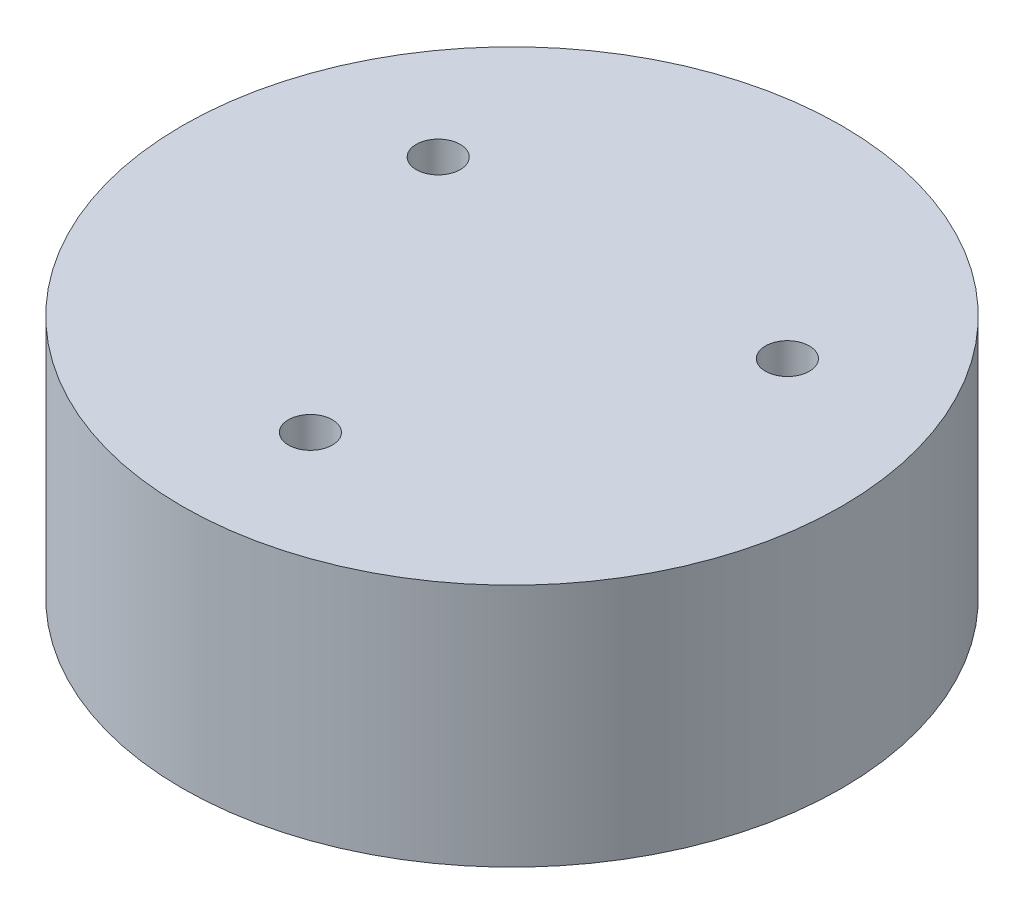
ISO-10303-21;
HEADER;
FILE_DESCRIPTION(('STEP AP214'),'2;1');
FILE_NAME('part.step','',(''),(''),'','','');
FILE_SCHEMA(('AUTOMOTIVE_DESIGN { 1 0 10303 214 1 1 1 1 }'));
ENDSEC;
DATA;
#1=APPLICATION_CONTEXT('core data for automotive mechanical design processes');
#2=APPLICATION_PROTOCOL_DEFINITION('international standard','automotive_design',2000,#1);
#3=PRODUCT_CONTEXT('',#1,'mechanical');
#4=PRODUCT('Part','Part','',(#3));
#5=PRODUCT_RELATED_PRODUCT_CATEGORY('part','',(#4));
#6=PRODUCT_DEFINITION_FORMATION('','',#4);
#7=PRODUCT_DEFINITION_CONTEXT('part definition',#1,'design');
#8=PRODUCT_DEFINITION('design','',#6,#7);
#9=PRODUCT_DEFINITION_SHAPE('','',#8);
#10=(LENGTH_UNIT() NAMED_UNIT(*) SI_UNIT(.MILLI.,.METRE.));
#11=(NAMED_UNIT(*) PLANE_ANGLE_UNIT() SI_UNIT($,.RADIAN.));
#12=(NAMED_UNIT(*) SI_UNIT($,.STERADIAN.) SOLID_ANGLE_UNIT());
#13=UNCERTAINTY_MEASURE_WITH_UNIT(LENGTH_MEASURE(1.E-05),#10,'distance_accuracy_value','');
#14=(GEOMETRIC_REPRESENTATION_CONTEXT(3) GLOBAL_UNCERTAINTY_ASSIGNED_CONTEXT((#13)) GLOBAL_UNIT_ASSIGNED_CONTEXT((#10,
#11,#12)) REPRESENTATION_CONTEXT('',''));
#15=CARTESIAN_POINT('',(0.,0.,0.));
#16=DIRECTION('',(0.,0.,1.));
#17=DIRECTION('',(1.,0.,0.));
#18=AXIS2_PLACEMENT_3D('',#15,#16,#17);
#19=CARTESIAN_POINT('',(0.,0.,0.));
#20=DIRECTION('',(0.,1.,0.));
#21=DIRECTION('',(0.,0.,1.));
#22=AXIS2_PLACEMENT_3D('',#19,#20,#21);
#23=PLANE('',#22);
#24=CARTESIAN_POINT('',(-14.298079416481,0.,8.25500000000007));
#25=DIRECTION('',(0.,-1.,0.));
#26=DIRECTION('',(0.,0.,-1.));
#27=AXIS2_PLACEMENT_3D('',#24,#25,#26);
#28=CIRCLE('',#27,3.65000000000001);
#29=CARTESIAN_POINT('',(-14.298079416481,0.,4.60500000000006));
#30=VERTEX_POINT('',#29);
#31=EDGE_CURVE('E121',#30,#30,#28,.T.);
#32=ORIENTED_EDGE('',*,*,#31,.F.);
#33=EDGE_LOOP('',(#32));
#34=FACE_BOUND('',#33,.T.);
#35=CARTESIAN_POINT('',(0.,0.,-16.51));
#36=DIRECTION('',(0.,-1.,0.));
#37=DIRECTION('',(0.,0.,-1.));
#38=AXIS2_PLACEMENT_3D('',#35,#36,#37);
#39=CIRCLE('',#38,3.65000000000001);
#40=CARTESIAN_POINT('',(0.,0.,-20.16));
#41=VERTEX_POINT('',#40);
#42=EDGE_CURVE('E112',#41,#41,#39,.T.);
#43=ORIENTED_EDGE('',*,*,#42,.F.);
#44=EDGE_LOOP('',(#43));
#45=FACE_BOUND('',#44,.T.);
#46=CARTESIAN_POINT('',(14.2980794164811,0.,8.25499999999997));
#47=DIRECTION('',(0.,-1.,0.));
#48=DIRECTION('',(0.,0.,-1.));
#49=AXIS2_PLACEMENT_3D('',#46,#47,#48);
#50=CIRCLE('',#49,3.65000000000001);
#51=CARTESIAN_POINT('',(14.2980794164811,0.,4.60499999999995));
#52=VERTEX_POINT('',#51);
#53=EDGE_CURVE('E103',#52,#52,#50,.T.);
#54=ORIENTED_EDGE('',*,*,#53,.F.);
#55=EDGE_LOOP('',(#54));
#56=FACE_BOUND('',#55,.T.);
#57=CARTESIAN_POINT('',(14.2980794164811,0.,-8.25499999999996));
#58=DIRECTION('',(0.,-1.,0.));
#59=DIRECTION('',(0.,0.,-1.));
#60=AXIS2_PLACEMENT_3D('',#57,#58,#59);
#61=CIRCLE('',#60,3.275);
#62=CARTESIAN_POINT('',(14.2980794164811,0.,-11.53));
#63=VERTEX_POINT('',#62);
#64=EDGE_CURVE('E79',#63,#63,#61,.T.);
#65=ORIENTED_EDGE('',*,*,#64,.F.);
#66=EDGE_LOOP('',(#65));
#67=FACE_BOUND('',#66,.T.);
#68=CARTESIAN_POINT('',(-14.298079416481,0.,-8.25500000000007));
#69=DIRECTION('',(0.,-1.,0.));
#70=DIRECTION('',(0.,0.,-1.));
#71=AXIS2_PLACEMENT_3D('',#68,#69,#70);
#72=CIRCLE('',#71,3.275);
#73=CARTESIAN_POINT('',(-14.298079416481,0.,-11.5300000000001));
#74=VERTEX_POINT('',#73);
#75=EDGE_CURVE('E64',#74,#74,#72,.T.);
#76=ORIENTED_EDGE('',*,*,#75,.F.);
#77=EDGE_LOOP('',(#76));
#78=FACE_BOUND('',#77,.T.);
#79=CARTESIAN_POINT('',(0.,0.,0.));
#80=DIRECTION('',(0.,1.,0.));
#81=DIRECTION('',(0.,0.,1.));
#82=AXIS2_PLACEMENT_3D('',#79,#80,#81);
#83=CIRCLE('',#82,27.);
#84=CARTESIAN_POINT('',(0.,0.,27.));
#85=VERTEX_POINT('',#84);
#86=EDGE_CURVE('E44',#85,#85,#83,.T.);
#87=ORIENTED_EDGE('',*,*,#86,.F.);
#88=EDGE_LOOP('',(#87));
#89=FACE_BOUND('',#88,.T.);
#90=CARTESIAN_POINT('',(0.,0.,16.51));
#91=DIRECTION('',(0.,-1.,0.));
#92=DIRECTION('',(0.,0.,-1.));
#93=AXIS2_PLACEMENT_3D('',#90,#91,#92);
#94=CIRCLE('',#93,3.275);
#95=CARTESIAN_POINT('',(0.,0.,13.235));
#96=VERTEX_POINT('',#95);
#97=EDGE_CURVE('E94',#96,#96,#94,.T.);
#98=ORIENTED_EDGE('',*,*,#97,.F.);
#99=EDGE_LOOP('',(#98));
#100=FACE_BOUND('',#99,.T.);
#101=ADVANCED_FACE('F39',(#34,#45,#56,#67,#78,#89,#100),#23,.F.);
#102=CARTESIAN_POINT('',(0.,20.,0.));
#103=DIRECTION('',(0.,-1.,0.));
#104=DIRECTION('',(0.,0.,-1.));
#105=AXIS2_PLACEMENT_3D('',#102,#103,#104);
#106=CYLINDRICAL_SURFACE('',#105,27.);
#107=CARTESIAN_POINT('',(0.,20.,0.));
#108=DIRECTION('',(0.,1.,0.));
#109=DIRECTION('',(0.,0.,1.));
#110=AXIS2_PLACEMENT_3D('',#107,#108,#109);
#111=CIRCLE('',#110,27.);
#112=CARTESIAN_POINT('',(0.,20.,27.));
#113=VERTEX_POINT('',#112);
#114=EDGE_CURVE('E10',#113,#113,#111,.T.);
#115=ORIENTED_EDGE('',*,*,#114,.F.);
#116=EDGE_LOOP('',(#115));
#117=FACE_BOUND('',#116,.T.);
#118=ORIENTED_EDGE('',*,*,#86,.T.);
#119=EDGE_LOOP('',(#118));
#120=FACE_BOUND('',#119,.T.);
#121=ADVANCED_FACE('F130',(#117,#120),#106,.T.);
#122=CARTESIAN_POINT('',(0.,20.,0.));
#123=DIRECTION('',(0.,1.,0.));
#124=DIRECTION('',(0.,0.,1.));
#125=AXIS2_PLACEMENT_3D('',#122,#123,#124);
#126=PLANE('',#125);
#127=CARTESIAN_POINT('',(0.,20.,16.51));
#128=DIRECTION('',(0.,-1.,0.));
#129=DIRECTION('',(0.,0.,-1.));
#130=AXIS2_PLACEMENT_3D('',#127,#128,#129);
#131=CIRCLE('',#130,1.8);
#132=CARTESIAN_POINT('',(0.,20.,14.71));
#133=VERTEX_POINT('',#132);
#134=EDGE_CURVE('E82',#133,#133,#131,.T.);
#135=ORIENTED_EDGE('',*,*,#134,.T.);
#136=EDGE_LOOP('',(#135));
#137=FACE_BOUND('',#136,.T.);
#138=CARTESIAN_POINT('',(14.2980794164811,20.,-8.25499999999996));
#139=DIRECTION('',(0.,-1.,0.));
#140=DIRECTION('',(0.,0.,-1.));
#141=AXIS2_PLACEMENT_3D('',#138,#139,#140);
#142=CIRCLE('',#141,1.8);
#143=CARTESIAN_POINT('',(14.2980794164811,20.,-10.055));
#144=VERTEX_POINT('',#143);
#145=EDGE_CURVE('E67',#144,#144,#142,.T.);
#146=ORIENTED_EDGE('',*,*,#145,.T.);
#147=EDGE_LOOP('',(#146));
#148=FACE_BOUND('',#147,.T.);
#149=CARTESIAN_POINT('',(-14.298079416481,20.,-8.25500000000007));
#150=DIRECTION('',(0.,-1.,0.));
#151=DIRECTION('',(0.,0.,-1.));
#152=AXIS2_PLACEMENT_3D('',#149,#150,#151);
#153=CIRCLE('',#152,1.8);
#154=CARTESIAN_POINT('',(-14.298079416481,20.,-10.0550000000001));
#155=VERTEX_POINT('',#154);
#156=EDGE_CURVE('E51',#155,#155,#153,.T.);
#157=ORIENTED_EDGE('',*,*,#156,.T.);
#158=EDGE_LOOP('',(#157));
#159=FACE_BOUND('',#158,.T.);
#160=ORIENTED_EDGE('',*,*,#114,.T.);
#161=EDGE_LOOP('',(#160));
#162=FACE_BOUND('',#161,.T.);
#163=ADVANCED_FACE('F201',(#137,#148,#159,#162),#126,.T.);
#164=CARTESIAN_POINT('',(-14.298079416481,0.,-8.25500000000007));
#165=DIRECTION('',(0.,-1.,0.));
#166=DIRECTION('',(0.,0.,-1.));
#167=AXIS2_PLACEMENT_3D('',#164,#165,#166);
#168=CYLINDRICAL_SURFACE('',#167,1.8);
#169=ORIENTED_EDGE('',*,*,#156,.F.);
#170=EDGE_LOOP('',(#169));
#171=FACE_BOUND('',#170,.T.);
#172=CARTESIAN_POINT('',(-14.298079416481,16.,-8.25500000000007));
#173=DIRECTION('',(0.,-1.,0.));
#174=DIRECTION('',(0.,0.,-1.));
#175=AXIS2_PLACEMENT_3D('',#172,#173,#174);
#176=CIRCLE('',#175,1.8);
#177=CARTESIAN_POINT('',(-14.298079416481,16.,-10.0550000000001));
#178=VERTEX_POINT('',#177);
#179=EDGE_CURVE('E55',#178,#178,#176,.T.);
#180=ORIENTED_EDGE('',*,*,#179,.T.);
#181=EDGE_LOOP('',(#180));
#182=FACE_BOUND('',#181,.T.);
#183=ADVANCED_FACE('F197',(#171,#182),#168,.F.);
#184=CARTESIAN_POINT('',(-11.048079416481,16.,-8.25500000000007));
#185=DIRECTION('',(0.,1.,0.));
#186=DIRECTION('',(0.,0.,1.));
#187=AXIS2_PLACEMENT_3D('',#184,#185,#186);
#188=PLANE('',#187);
#189=ORIENTED_EDGE('',*,*,#179,.F.);
#190=EDGE_LOOP('',(#189));
#191=FACE_BOUND('',#190,.T.);
#192=CARTESIAN_POINT('',(-14.298079416481,16.,-8.25500000000007));
#193=DIRECTION('',(0.,-1.,0.));
#194=DIRECTION('',(0.,0.,-1.));
#195=AXIS2_PLACEMENT_3D('',#192,#193,#194);
#196=CIRCLE('',#195,3.25);
#197=CARTESIAN_POINT('',(-14.298079416481,16.,-11.5050000000001));
#198=VERTEX_POINT('',#197);
#199=EDGE_CURVE('E58',#198,#198,#196,.T.);
#200=ORIENTED_EDGE('',*,*,#199,.T.);
#201=EDGE_LOOP('',(#200));
#202=FACE_BOUND('',#201,.T.);
#203=ADVANCED_FACE('F193',(#191,#202),#188,.F.);
#204=CARTESIAN_POINT('',(-14.298079416481,0.,-8.25500000000007));
#205=DIRECTION('',(0.,-1.,0.));
#206=DIRECTION('',(0.,0.,-1.));
#207=AXIS2_PLACEMENT_3D('',#204,#205,#206);
#208=CYLINDRICAL_SURFACE('',#207,3.25);
#209=ORIENTED_EDGE('',*,*,#199,.F.);
#210=EDGE_LOOP('',(#209));
#211=FACE_BOUND('',#210,.T.);
#212=CARTESIAN_POINT('',(-14.298079416481,0.0250000000000006,-8.25500000000007));
#213=DIRECTION('',(0.,-1.,0.));
#214=DIRECTION('',(0.,0.,-1.));
#215=AXIS2_PLACEMENT_3D('',#212,#213,#214);
#216=CIRCLE('',#215,3.25);
#217=CARTESIAN_POINT('',(-14.298079416481,0.0250000000000006,-11.5050000000001));
#218=VERTEX_POINT('',#217);
#219=EDGE_CURVE('E61',#218,#218,#216,.T.);
#220=ORIENTED_EDGE('',*,*,#219,.T.);
#221=EDGE_LOOP('',(#220));
#222=FACE_BOUND('',#221,.T.);
#223=ADVANCED_FACE('F189',(#211,#222),#208,.F.);
#224=CARTESIAN_POINT('',(-14.298079416481,0.,-8.25500000000007));
#225=DIRECTION('',(0.,-1.,0.));
#226=DIRECTION('',(0.,0.,-1.));
#227=AXIS2_PLACEMENT_3D('',#224,#225,#226);
#228=CONICAL_SURFACE('',#227,3.275,0.785398163397451);
#229=ORIENTED_EDGE('',*,*,#219,.F.);
#230=EDGE_LOOP('',(#229));
#231=FACE_BOUND('',#230,.T.);
#232=ORIENTED_EDGE('',*,*,#75,.T.);
#233=EDGE_LOOP('',(#232));
#234=FACE_BOUND('',#233,.T.);
#235=ADVANCED_FACE('F185',(#231,#234),#228,.F.);
#236=CARTESIAN_POINT('',(14.2980794164811,0.,-8.25499999999996));
#237=DIRECTION('',(0.,-1.,0.));
#238=DIRECTION('',(0.,0.,-1.));
#239=AXIS2_PLACEMENT_3D('',#236,#237,#238);
#240=CYLINDRICAL_SURFACE('',#239,1.8);
#241=ORIENTED_EDGE('',*,*,#145,.F.);
#242=EDGE_LOOP('',(#241));
#243=FACE_BOUND('',#242,.T.);
#244=CARTESIAN_POINT('',(14.2980794164811,16.,-8.25499999999996));
#245=DIRECTION('',(0.,-1.,0.));
#246=DIRECTION('',(0.,0.,-1.));
#247=AXIS2_PLACEMENT_3D('',#244,#245,#246);
#248=CIRCLE('',#247,1.8);
#249=CARTESIAN_POINT('',(14.2980794164811,16.,-10.055));
#250=VERTEX_POINT('',#249);
#251=EDGE_CURVE('E70',#250,#250,#248,.T.);
#252=ORIENTED_EDGE('',*,*,#251,.T.);
#253=EDGE_LOOP('',(#252));
#254=FACE_BOUND('',#253,.T.);
#255=ADVANCED_FACE('F181',(#243,#254),#240,.F.);
#256=CARTESIAN_POINT('',(17.5480794164811,16.,-8.25499999999996));
#257=DIRECTION('',(0.,1.,0.));
#258=DIRECTION('',(0.,0.,1.));
#259=AXIS2_PLACEMENT_3D('',#256,#257,#258);
#260=PLANE('',#259);
#261=ORIENTED_EDGE('',*,*,#251,.F.);
#262=EDGE_LOOP('',(#261));
#263=FACE_BOUND('',#262,.T.);
#264=CARTESIAN_POINT('',(14.2980794164811,16.,-8.25499999999996));
#265=DIRECTION('',(0.,-1.,0.));
#266=DIRECTION('',(0.,0.,-1.));
#267=AXIS2_PLACEMENT_3D('',#264,#265,#266);
#268=CIRCLE('',#267,3.25);
#269=CARTESIAN_POINT('',(14.2980794164811,16.,-11.505));
#270=VERTEX_POINT('',#269);
#271=EDGE_CURVE('E73',#270,#270,#268,.T.);
#272=ORIENTED_EDGE('',*,*,#271,.T.);
#273=EDGE_LOOP('',(#272));
#274=FACE_BOUND('',#273,.T.);
#275=ADVANCED_FACE('F177',(#263,#274),#260,.F.);
#276=CARTESIAN_POINT('',(14.2980794164811,0.,-8.25499999999996));
#277=DIRECTION('',(0.,-1.,0.));
#278=DIRECTION('',(0.,0.,-1.));
#279=AXIS2_PLACEMENT_3D('',#276,#277,#278);
#280=CYLINDRICAL_SURFACE('',#279,3.25);
#281=ORIENTED_EDGE('',*,*,#271,.F.);
#282=EDGE_LOOP('',(#281));
#283=FACE_BOUND('',#282,.T.);
#284=CARTESIAN_POINT('',(14.2980794164811,0.0250000000000006,-8.25499999999996));
#285=DIRECTION('',(0.,-1.,0.));
#286=DIRECTION('',(0.,0.,-1.));
#287=AXIS2_PLACEMENT_3D('',#284,#285,#286);
#288=CIRCLE('',#287,3.25);
#289=CARTESIAN_POINT('',(14.2980794164811,0.0250000000000006,-11.505));
#290=VERTEX_POINT('',#289);
#291=EDGE_CURVE('E76',#290,#290,#288,.T.);
#292=ORIENTED_EDGE('',*,*,#291,.T.);
#293=EDGE_LOOP('',(#292));
#294=FACE_BOUND('',#293,.T.);
#295=ADVANCED_FACE('F173',(#283,#294),#280,.F.);
#296=CARTESIAN_POINT('',(14.2980794164811,0.,-8.25499999999996));
#297=DIRECTION('',(0.,-1.,0.));
#298=DIRECTION('',(0.,0.,-1.));
#299=AXIS2_PLACEMENT_3D('',#296,#297,#298);
#300=CONICAL_SURFACE('',#299,3.275,0.785398163397451);
#301=ORIENTED_EDGE('',*,*,#291,.F.);
#302=EDGE_LOOP('',(#301));
#303=FACE_BOUND('',#302,.T.);
#304=ORIENTED_EDGE('',*,*,#64,.T.);
#305=EDGE_LOOP('',(#304));
#306=FACE_BOUND('',#305,.T.);
#307=ADVANCED_FACE('F169',(#303,#306),#300,.F.);
#308=CARTESIAN_POINT('',(0.,0.,16.51));
#309=DIRECTION('',(0.,-1.,0.));
#310=DIRECTION('',(0.,0.,-1.));
#311=AXIS2_PLACEMENT_3D('',#308,#309,#310);
#312=CYLINDRICAL_SURFACE('',#311,1.8);
#313=ORIENTED_EDGE('',*,*,#134,.F.);
#314=EDGE_LOOP('',(#313));
#315=FACE_BOUND('',#314,.T.);
#316=CARTESIAN_POINT('',(0.,16.,16.51));
#317=DIRECTION('',(0.,-1.,0.));
#318=DIRECTION('',(0.,0.,-1.));
#319=AXIS2_PLACEMENT_3D('',#316,#317,#318);
#320=CIRCLE('',#319,1.8);
#321=CARTESIAN_POINT('',(0.,16.,14.71));
#322=VERTEX_POINT('',#321);
#323=EDGE_CURVE('E85',#322,#322,#320,.T.);
#324=ORIENTED_EDGE('',*,*,#323,.T.);
#325=EDGE_LOOP('',(#324));
#326=FACE_BOUND('',#325,.T.);
#327=ADVANCED_FACE('F165',(#315,#326),#312,.F.);
#328=CARTESIAN_POINT('',(3.24999999999999,16.,16.51));
#329=DIRECTION('',(0.,1.,0.));
#330=DIRECTION('',(0.,0.,1.));
#331=AXIS2_PLACEMENT_3D('',#328,#329,#330);
#332=PLANE('',#331);
#333=ORIENTED_EDGE('',*,*,#323,.F.);
#334=EDGE_LOOP('',(#333));
#335=FACE_BOUND('',#334,.T.);
#336=CARTESIAN_POINT('',(0.,16.,16.51));
#337=DIRECTION('',(0.,-1.,0.));
#338=DIRECTION('',(0.,0.,-1.));
#339=AXIS2_PLACEMENT_3D('',#336,#337,#338);
#340=CIRCLE('',#339,3.25);
#341=CARTESIAN_POINT('',(0.,16.,13.26));
#342=VERTEX_POINT('',#341);
#343=EDGE_CURVE('E88',#342,#342,#340,.T.);
#344=ORIENTED_EDGE('',*,*,#343,.T.);
#345=EDGE_LOOP('',(#344));
#346=FACE_BOUND('',#345,.T.);
#347=ADVANCED_FACE('F157',(#335,#346),#332,.F.);
#348=CARTESIAN_POINT('',(0.,0.,16.51));
#349=DIRECTION('',(0.,-1.,0.));
#350=DIRECTION('',(0.,0.,-1.));
#351=AXIS2_PLACEMENT_3D('',#348,#349,#350);
#352=CYLINDRICAL_SURFACE('',#351,3.25);
#353=ORIENTED_EDGE('',*,*,#343,.F.);
#354=EDGE_LOOP('',(#353));
#355=FACE_BOUND('',#354,.T.);
#356=CARTESIAN_POINT('',(0.,0.0250000000000006,16.51));
#357=DIRECTION('',(0.,-1.,0.));
#358=DIRECTION('',(0.,0.,-1.));
#359=AXIS2_PLACEMENT_3D('',#356,#357,#358);
#360=CIRCLE('',#359,3.25);
#361=CARTESIAN_POINT('',(0.,0.0250000000000006,13.26));
#362=VERTEX_POINT('',#361);
#363=EDGE_CURVE('E91',#362,#362,#360,.T.);
#364=ORIENTED_EDGE('',*,*,#363,.T.);
#365=EDGE_LOOP('',(#364));
#366=FACE_BOUND('',#365,.T.);
#367=ADVANCED_FACE('F147',(#355,#366),#352,.F.);
#368=CARTESIAN_POINT('',(0.,0.,16.51));
#369=DIRECTION('',(0.,-1.,0.));
#370=DIRECTION('',(0.,0.,-1.));
#371=AXIS2_PLACEMENT_3D('',#368,#369,#370);
#372=CONICAL_SURFACE('',#371,3.275,0.785398163397451);
#373=ORIENTED_EDGE('',*,*,#363,.F.);
#374=EDGE_LOOP('',(#373));
#375=FACE_BOUND('',#374,.T.);
#376=ORIENTED_EDGE('',*,*,#97,.T.);
#377=EDGE_LOOP('',(#376));
#378=FACE_BOUND('',#377,.T.);
#379=ADVANCED_FACE('F144',(#375,#378),#372,.F.);
#380=CARTESIAN_POINT('',(14.2980794164811,15.,8.25499999999997));
#381=DIRECTION('',(0.,1.,0.));
#382=DIRECTION('',(0.,0.,1.));
#383=AXIS2_PLACEMENT_3D('',#380,#381,#382);
#384=PLANE('',#383);
#385=CARTESIAN_POINT('',(14.2980794164811,15.,8.25499999999997));
#386=DIRECTION('',(0.,-1.,0.));
#387=DIRECTION('',(0.,0.,-1.));
#388=AXIS2_PLACEMENT_3D('',#385,#386,#387);
#389=CIRCLE('',#388,3.20000000000001);
#390=CARTESIAN_POINT('',(14.2980794164811,15.,5.05499999999995));
#391=VERTEX_POINT('',#390);
#392=EDGE_CURVE('E97',#391,#391,#389,.T.);
#393=ORIENTED_EDGE('',*,*,#392,.T.);
#394=EDGE_LOOP('',(#393));
#395=FACE_BOUND('',#394,.T.);
#396=ADVANCED_FACE('F146',(#395),#384,.F.);
#397=CARTESIAN_POINT('',(14.2980794164811,0.,8.25499999999997));
#398=DIRECTION('',(0.,-1.,0.));
#399=DIRECTION('',(0.,0.,-1.));
#400=AXIS2_PLACEMENT_3D('',#397,#398,#399);
#401=CYLINDRICAL_SURFACE('',#400,3.20000000000001);
#402=ORIENTED_EDGE('',*,*,#392,.F.);
#403=EDGE_LOOP('',(#402));
#404=FACE_BOUND('',#403,.T.);
#405=CARTESIAN_POINT('',(14.2980794164811,2.,8.25499999999997));
#406=DIRECTION('',(0.,-1.,0.));
#407=DIRECTION('',(0.,0.,-1.));
#408=AXIS2_PLACEMENT_3D('',#405,#406,#407);
#409=CIRCLE('',#408,3.20000000000001);
#410=CARTESIAN_POINT('',(14.2980794164811,2.,5.05499999999995));
#411=VERTEX_POINT('',#410);
#412=EDGE_CURVE('E100',#411,#411,#409,.T.);
#413=ORIENTED_EDGE('',*,*,#412,.T.);
#414=EDGE_LOOP('',(#413));
#415=FACE_BOUND('',#414,.T.);
#416=ADVANCED_FACE('F154',(#404,#415),#401,.F.);
#417=CARTESIAN_POINT('',(0.,15.,-16.51));
#418=DIRECTION('',(0.,1.,0.));
#419=DIRECTION('',(0.,0.,1.));
#420=AXIS2_PLACEMENT_3D('',#417,#418,#419);
#421=PLANE('',#420);
#422=CARTESIAN_POINT('',(0.,15.,-16.51));
#423=DIRECTION('',(0.,-1.,0.));
#424=DIRECTION('',(0.,0.,-1.));
#425=AXIS2_PLACEMENT_3D('',#422,#423,#424);
#426=CIRCLE('',#425,3.20000000000001);
#427=CARTESIAN_POINT('',(0.,15.,-19.71));
#428=VERTEX_POINT('',#427);
#429=EDGE_CURVE('E106',#428,#428,#426,.T.);
#430=ORIENTED_EDGE('',*,*,#429,.T.);
#431=EDGE_LOOP('',(#430));
#432=FACE_BOUND('',#431,.T.);
#433=ADVANCED_FACE('F230',(#432),#421,.F.);
#434=CARTESIAN_POINT('',(0.,0.,-16.51));
#435=DIRECTION('',(0.,-1.,0.));
#436=DIRECTION('',(0.,0.,-1.));
#437=AXIS2_PLACEMENT_3D('',#434,#435,#436);
#438=CYLINDRICAL_SURFACE('',#437,3.20000000000001);
#439=ORIENTED_EDGE('',*,*,#429,.F.);
#440=EDGE_LOOP('',(#439));
#441=FACE_BOUND('',#440,.T.);
#442=CARTESIAN_POINT('',(0.,2.,-16.51));
#443=DIRECTION('',(0.,-1.,0.));
#444=DIRECTION('',(0.,0.,-1.));
#445=AXIS2_PLACEMENT_3D('',#442,#443,#444);
#446=CIRCLE('',#445,3.20000000000001);
#447=CARTESIAN_POINT('',(0.,2.,-19.71));
#448=VERTEX_POINT('',#447);
#449=EDGE_CURVE('E109',#448,#448,#446,.T.);
#450=ORIENTED_EDGE('',*,*,#449,.T.);
#451=EDGE_LOOP('',(#450));
#452=FACE_BOUND('',#451,.T.);
#453=ADVANCED_FACE('F227',(#441,#452),#438,.F.);
#454=CARTESIAN_POINT('',(-14.298079416481,15.,8.25500000000007));
#455=DIRECTION('',(0.,1.,0.));
#456=DIRECTION('',(0.,0.,1.));
#457=AXIS2_PLACEMENT_3D('',#454,#455,#456);
#458=PLANE('',#457);
#459=CARTESIAN_POINT('',(-14.298079416481,15.,8.25500000000007));
#460=DIRECTION('',(0.,-1.,0.));
#461=DIRECTION('',(0.,0.,-1.));
#462=AXIS2_PLACEMENT_3D('',#459,#460,#461);
#463=CIRCLE('',#462,3.20000000000001);
#464=CARTESIAN_POINT('',(-14.298079416481,15.,5.05500000000006));
#465=VERTEX_POINT('',#464);
#466=EDGE_CURVE('E115',#465,#465,#463,.T.);
#467=ORIENTED_EDGE('',*,*,#466,.T.);
#468=EDGE_LOOP('',(#467));
#469=FACE_BOUND('',#468,.T.);
#470=ADVANCED_FACE('F229',(#469),#458,.F.);
#471=CARTESIAN_POINT('',(-14.298079416481,0.,8.25500000000007));
#472=DIRECTION('',(0.,-1.,0.));
#473=DIRECTION('',(0.,0.,-1.));
#474=AXIS2_PLACEMENT_3D('',#471,#472,#473);
#475=CYLINDRICAL_SURFACE('',#474,3.20000000000001);
#476=ORIENTED_EDGE('',*,*,#466,.F.);
#477=EDGE_LOOP('',(#476));
#478=FACE_BOUND('',#477,.T.);
#479=CARTESIAN_POINT('',(-14.298079416481,2.,8.25500000000007));
#480=DIRECTION('',(0.,-1.,0.));
#481=DIRECTION('',(0.,0.,-1.));
#482=AXIS2_PLACEMENT_3D('',#479,#480,#481);
#483=CIRCLE('',#482,3.20000000000001);
#484=CARTESIAN_POINT('',(-14.298079416481,2.,5.05500000000005));
#485=VERTEX_POINT('',#484);
#486=EDGE_CURVE('E118',#485,#485,#483,.T.);
#487=ORIENTED_EDGE('',*,*,#486,.T.);
#488=EDGE_LOOP('',(#487));
#489=FACE_BOUND('',#488,.T.);
#490=ADVANCED_FACE('F215',(#478,#489),#475,.F.);
#491=CARTESIAN_POINT('',(-14.298079416481,2.,8.25500000000007));
#492=DIRECTION('',(0.,-1.,0.));
#493=DIRECTION('',(0.,0.,-1.));
#494=AXIS2_PLACEMENT_3D('',#491,#492,#493);
#495=CONICAL_SURFACE('',#494,3.20000000000003,0.221314442347795);
#496=ORIENTED_EDGE('',*,*,#31,.T.);
#497=EDGE_LOOP('',(#496));
#498=FACE_BOUND('',#497,.T.);
#499=ORIENTED_EDGE('',*,*,#486,.F.);
#500=EDGE_LOOP('',(#499));
#501=FACE_BOUND('',#500,.T.);
#502=ADVANCED_FACE('F125',(#498,#501),#495,.F.);
#503=CARTESIAN_POINT('',(0.,2.,-16.51));
#504=DIRECTION('',(0.,-1.,0.));
#505=DIRECTION('',(0.,0.,-1.));
#506=AXIS2_PLACEMENT_3D('',#503,#504,#505);
#507=CONICAL_SURFACE('',#506,3.20000000000003,0.221314442347795);
#508=ORIENTED_EDGE('',*,*,#42,.T.);
#509=EDGE_LOOP('',(#508));
#510=FACE_BOUND('',#509,.T.);
#511=ORIENTED_EDGE('',*,*,#449,.F.);
#512=EDGE_LOOP('',(#511));
#513=FACE_BOUND('',#512,.T.);
#514=ADVANCED_FACE('F214',(#510,#513),#507,.F.);
#515=CARTESIAN_POINT('',(14.2980794164811,2.,8.25499999999997));
#516=DIRECTION('',(0.,-1.,0.));
#517=DIRECTION('',(0.,0.,-1.));
#518=AXIS2_PLACEMENT_3D('',#515,#516,#517);
#519=CONICAL_SURFACE('',#518,3.20000000000003,0.221314442347795);
#520=ORIENTED_EDGE('',*,*,#53,.T.);
#521=EDGE_LOOP('',(#520));
#522=FACE_BOUND('',#521,.T.);
#523=ORIENTED_EDGE('',*,*,#412,.F.);
#524=EDGE_LOOP('',(#523));
#525=FACE_BOUND('',#524,.T.);
#526=ADVANCED_FACE('F42',(#522,#525),#519,.F.);
#527=CLOSED_SHELL('',(#101,#121,#163,#183,#203,#223,#235,#255,#275,#295,#307,#327,#347,#367,
#379,#396,#416,#433,#453,#470,#490,#502,#514,#526));
#528=MANIFOLD_SOLID_BREP('B2',#527);
#529=ADVANCED_BREP_SHAPE_REPRESENTATION('',(#18,#528),#14);
#530=SHAPE_DEFINITION_REPRESENTATION(#9,#529);
ENDSEC;
END-ISO-10303-21;
